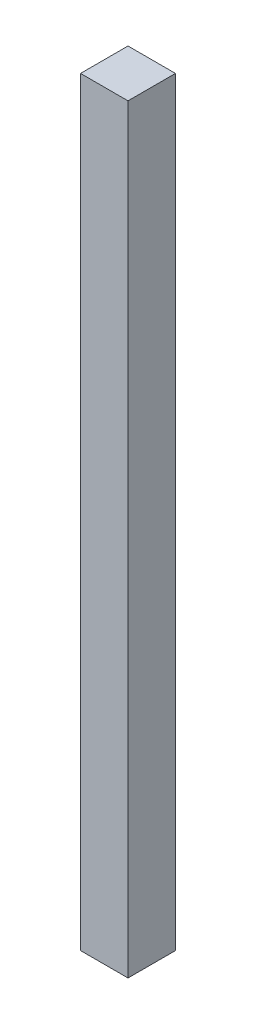
ISO-10303-21;
HEADER;
FILE_DESCRIPTION(('STEP AP214'),'2;1');
FILE_NAME('part.step','',(''),(''),'','','');
FILE_SCHEMA(('AUTOMOTIVE_DESIGN { 1 0 10303 214 1 1 1 1 }'));
ENDSEC;
DATA;
#1=APPLICATION_CONTEXT('core data for automotive mechanical design processes');
#2=APPLICATION_PROTOCOL_DEFINITION('international standard','automotive_design',2000,#1);
#3=PRODUCT_CONTEXT('',#1,'mechanical');
#4=PRODUCT('Part','Part','',(#3));
#5=PRODUCT_RELATED_PRODUCT_CATEGORY('part','',(#4));
#6=PRODUCT_DEFINITION_FORMATION('','',#4);
#7=PRODUCT_DEFINITION_CONTEXT('part definition',#1,'design');
#8=PRODUCT_DEFINITION('design','',#6,#7);
#9=PRODUCT_DEFINITION_SHAPE('','',#8);
#10=(LENGTH_UNIT() NAMED_UNIT(*) SI_UNIT(.MILLI.,.METRE.));
#11=(NAMED_UNIT(*) PLANE_ANGLE_UNIT() SI_UNIT($,.RADIAN.));
#12=(NAMED_UNIT(*) SI_UNIT($,.STERADIAN.) SOLID_ANGLE_UNIT());
#13=UNCERTAINTY_MEASURE_WITH_UNIT(LENGTH_MEASURE(1.E-05),#10,'distance_accuracy_value','');
#14=(GEOMETRIC_REPRESENTATION_CONTEXT(3) GLOBAL_UNCERTAINTY_ASSIGNED_CONTEXT((#13)) GLOBAL_UNIT_ASSIGNED_CONTEXT((#10,
#11,#12)) REPRESENTATION_CONTEXT('',''));
#15=CARTESIAN_POINT('',(0.,0.,0.));
#16=DIRECTION('',(0.,0.,1.));
#17=DIRECTION('',(1.,0.,0.));
#18=AXIS2_PLACEMENT_3D('',#15,#16,#17);
#19=CARTESIAN_POINT('',(0.,40.,0.));
#20=DIRECTION('',(1.,0.,0.));
#21=DIRECTION('',(0.,0.,-1.));
#22=AXIS2_PLACEMENT_3D('',#19,#20,#21);
#23=PLANE('',#22);
#24=DIRECTION('',(0.,0.,1.));
#25=VECTOR('',#24,1.);
#26=CARTESIAN_POINT('',(0.,0.,0.));
#27=LINE('',#26,#25);
#28=CARTESIAN_POINT('',(0.,0.,0.));
#29=VERTEX_POINT('',#28);
#30=CARTESIAN_POINT('',(0.,0.,2.5));
#31=VERTEX_POINT('',#30);
#32=EDGE_CURVE('E102',#29,#31,#27,.T.);
#33=ORIENTED_EDGE('',*,*,#32,.T.);
#34=DIRECTION('',(0.,-1.,0.));
#35=VECTOR('',#34,1.);
#36=CARTESIAN_POINT('',(0.,40.,2.5));
#37=LINE('',#36,#35);
#38=CARTESIAN_POINT('',(0.,40.,2.5));
#39=VERTEX_POINT('',#38);
#40=EDGE_CURVE('E11',#39,#31,#37,.T.);
#41=ORIENTED_EDGE('',*,*,#40,.F.);
#42=DIRECTION('',(0.,0.,1.));
#43=VECTOR('',#42,1.);
#44=CARTESIAN_POINT('',(0.,40.,0.));
#45=LINE('',#44,#43);
#46=CARTESIAN_POINT('',(0.,40.,0.));
#47=VERTEX_POINT('',#46);
#48=EDGE_CURVE('E90',#47,#39,#45,.T.);
#49=ORIENTED_EDGE('',*,*,#48,.F.);
#50=DIRECTION('',(0.,-1.,0.));
#51=VECTOR('',#50,1.);
#52=CARTESIAN_POINT('',(0.,40.,0.));
#53=LINE('',#52,#51);
#54=EDGE_CURVE('E98',#47,#29,#53,.T.);
#55=ORIENTED_EDGE('',*,*,#54,.T.);
#56=EDGE_LOOP('',(#33,#41,#49,#55));
#57=FACE_BOUND('',#56,.T.);
#58=ADVANCED_FACE('F39',(#57),#23,.F.);
#59=CARTESIAN_POINT('',(0.,40.,2.5));
#60=DIRECTION('',(0.,0.,-1.));
#61=DIRECTION('',(-1.,0.,0.));
#62=AXIS2_PLACEMENT_3D('',#59,#60,#61);
#63=PLANE('',#62);
#64=DIRECTION('',(1.,0.,0.));
#65=VECTOR('',#64,1.);
#66=CARTESIAN_POINT('',(0.,0.,2.5));
#67=LINE('',#66,#65);
#68=CARTESIAN_POINT('',(2.5,0.,2.5));
#69=VERTEX_POINT('',#68);
#70=EDGE_CURVE('E94',#31,#69,#67,.T.);
#71=ORIENTED_EDGE('',*,*,#70,.T.);
#72=DIRECTION('',(0.,-1.,0.));
#73=VECTOR('',#72,1.);
#74=CARTESIAN_POINT('',(2.5,40.,2.5));
#75=LINE('',#74,#73);
#76=CARTESIAN_POINT('',(2.5,40.,2.5));
#77=VERTEX_POINT('',#76);
#78=EDGE_CURVE('E47',#77,#69,#75,.T.);
#79=ORIENTED_EDGE('',*,*,#78,.F.);
#80=DIRECTION('',(1.,0.,0.));
#81=VECTOR('',#80,1.);
#82=CARTESIAN_POINT('',(0.,40.,2.5));
#83=LINE('',#82,#81);
#84=EDGE_CURVE('E85',#39,#77,#83,.T.);
#85=ORIENTED_EDGE('',*,*,#84,.F.);
#86=ORIENTED_EDGE('',*,*,#40,.T.);
#87=EDGE_LOOP('',(#71,#79,#85,#86));
#88=FACE_BOUND('',#87,.T.);
#89=ADVANCED_FACE('F93',(#88),#63,.F.);
#90=CARTESIAN_POINT('',(2.5,40.,0.));
#91=DIRECTION('',(-1.,0.,0.));
#92=DIRECTION('',(0.,0.,1.));
#93=AXIS2_PLACEMENT_3D('',#90,#91,#92);
#94=PLANE('',#93);
#95=DIRECTION('',(0.,0.,-1.));
#96=VECTOR('',#95,1.);
#97=CARTESIAN_POINT('',(2.5,0.,0.));
#98=LINE('',#97,#96);
#99=CARTESIAN_POINT('',(2.5,0.,0.));
#100=VERTEX_POINT('',#99);
#101=EDGE_CURVE('E72',#69,#100,#98,.T.);
#102=ORIENTED_EDGE('',*,*,#101,.T.);
#103=DIRECTION('',(0.,-1.,0.));
#104=VECTOR('',#103,1.);
#105=CARTESIAN_POINT('',(2.5,40.,0.));
#106=LINE('',#105,#104);
#107=CARTESIAN_POINT('',(2.5,40.,0.));
#108=VERTEX_POINT('',#107);
#109=EDGE_CURVE('E95',#108,#100,#106,.T.);
#110=ORIENTED_EDGE('',*,*,#109,.F.);
#111=DIRECTION('',(0.,0.,-1.));
#112=VECTOR('',#111,1.);
#113=CARTESIAN_POINT('',(2.5,40.,0.));
#114=LINE('',#113,#112);
#115=EDGE_CURVE('E88',#77,#108,#114,.T.);
#116=ORIENTED_EDGE('',*,*,#115,.F.);
#117=ORIENTED_EDGE('',*,*,#78,.T.);
#118=EDGE_LOOP('',(#102,#110,#116,#117));
#119=FACE_BOUND('',#118,.T.);
#120=ADVANCED_FACE('F96',(#119),#94,.F.);
#121=CARTESIAN_POINT('',(0.,40.,0.));
#122=DIRECTION('',(0.,0.,1.));
#123=DIRECTION('',(1.,0.,0.));
#124=AXIS2_PLACEMENT_3D('',#121,#122,#123);
#125=PLANE('',#124);
#126=DIRECTION('',(-1.,0.,0.));
#127=VECTOR('',#126,1.);
#128=CARTESIAN_POINT('',(0.,0.,0.));
#129=LINE('',#128,#127);
#130=EDGE_CURVE('E78',#100,#29,#129,.T.);
#131=ORIENTED_EDGE('',*,*,#130,.T.);
#132=ORIENTED_EDGE('',*,*,#54,.F.);
#133=DIRECTION('',(-1.,0.,0.));
#134=VECTOR('',#133,1.);
#135=CARTESIAN_POINT('',(0.,40.,0.));
#136=LINE('',#135,#134);
#137=EDGE_CURVE('E55',#108,#47,#136,.T.);
#138=ORIENTED_EDGE('',*,*,#137,.F.);
#139=ORIENTED_EDGE('',*,*,#109,.T.);
#140=EDGE_LOOP('',(#131,#132,#138,#139));
#141=FACE_BOUND('',#140,.T.);
#142=ADVANCED_FACE('F109',(#141),#125,.F.);
#143=CARTESIAN_POINT('',(0.,40.,0.));
#144=DIRECTION('',(0.,1.,0.));
#145=DIRECTION('',(0.,0.,1.));
#146=AXIS2_PLACEMENT_3D('',#143,#144,#145);
#147=PLANE('',#146);
#148=ORIENTED_EDGE('',*,*,#48,.T.);
#149=ORIENTED_EDGE('',*,*,#84,.T.);
#150=ORIENTED_EDGE('',*,*,#115,.T.);
#151=ORIENTED_EDGE('',*,*,#137,.T.);
#152=EDGE_LOOP('',(#148,#149,#150,#151));
#153=FACE_BOUND('',#152,.T.);
#154=ADVANCED_FACE('F86',(#153),#147,.T.);
#155=CARTESIAN_POINT('',(0.,0.,0.));
#156=DIRECTION('',(0.,1.,0.));
#157=DIRECTION('',(0.,0.,1.));
#158=AXIS2_PLACEMENT_3D('',#155,#156,#157);
#159=PLANE('',#158);
#160=ORIENTED_EDGE('',*,*,#32,.F.);
#161=ORIENTED_EDGE('',*,*,#130,.F.);
#162=ORIENTED_EDGE('',*,*,#101,.F.);
#163=ORIENTED_EDGE('',*,*,#70,.F.);
#164=EDGE_LOOP('',(#160,#161,#162,#163));
#165=FACE_BOUND('',#164,.T.);
#166=ADVANCED_FACE('F112',(#165),#159,.F.);
#167=CLOSED_SHELL('',(#58,#89,#120,#142,#154,#166));
#168=MANIFOLD_SOLID_BREP('B2',#167);
#169=ADVANCED_BREP_SHAPE_REPRESENTATION('',(#18,#168),#14);
#170=SHAPE_DEFINITION_REPRESENTATION(#9,#169);
ENDSEC;
END-ISO-10303-21;
